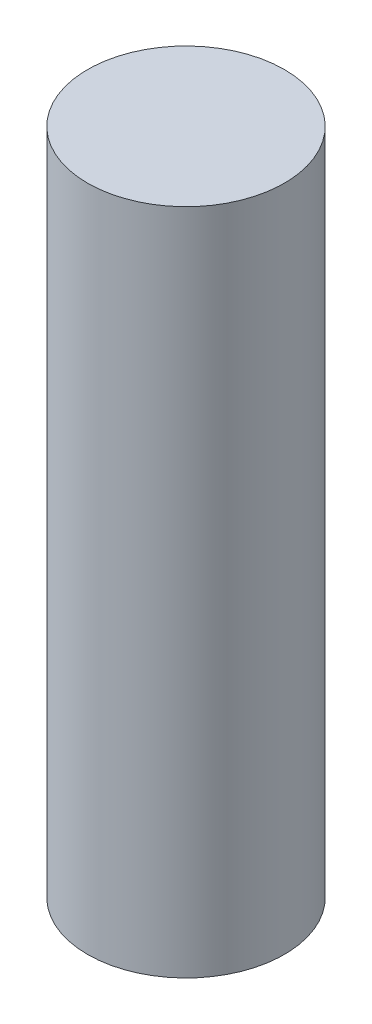
ISO-10303-21;
HEADER;
FILE_DESCRIPTION(('STEP AP214'),'2;1');
FILE_NAME('part.step','',(''),(''),'','','');
FILE_SCHEMA(('AUTOMOTIVE_DESIGN { 1 0 10303 214 1 1 1 1 }'));
ENDSEC;
DATA;
#1=APPLICATION_CONTEXT('core data for automotive mechanical design processes');
#2=APPLICATION_PROTOCOL_DEFINITION('international standard','automotive_design',2000,#1);
#3=PRODUCT_CONTEXT('',#1,'mechanical');
#4=PRODUCT('Part','Part','',(#3));
#5=PRODUCT_RELATED_PRODUCT_CATEGORY('part','',(#4));
#6=PRODUCT_DEFINITION_FORMATION('','',#4);
#7=PRODUCT_DEFINITION_CONTEXT('part definition',#1,'design');
#8=PRODUCT_DEFINITION('design','',#6,#7);
#9=PRODUCT_DEFINITION_SHAPE('','',#8);
#10=(LENGTH_UNIT() NAMED_UNIT(*) SI_UNIT(.MILLI.,.METRE.));
#11=(NAMED_UNIT(*) PLANE_ANGLE_UNIT() SI_UNIT($,.RADIAN.));
#12=(NAMED_UNIT(*) SI_UNIT($,.STERADIAN.) SOLID_ANGLE_UNIT());
#13=UNCERTAINTY_MEASURE_WITH_UNIT(LENGTH_MEASURE(1.E-05),#10,'distance_accuracy_value','');
#14=(GEOMETRIC_REPRESENTATION_CONTEXT(3) GLOBAL_UNCERTAINTY_ASSIGNED_CONTEXT((#13)) GLOBAL_UNIT_ASSIGNED_CONTEXT((#10,
#11,#12)) REPRESENTATION_CONTEXT('',''));
#15=CARTESIAN_POINT('',(0.,0.,0.));
#16=DIRECTION('',(0.,0.,1.));
#17=DIRECTION('',(1.,0.,0.));
#18=AXIS2_PLACEMENT_3D('',#15,#16,#17);
#19=CARTESIAN_POINT('',(0.,9.5,0.));
#20=DIRECTION('',(0.,-1.,0.));
#21=DIRECTION('',(0.,0.,-1.));
#22=AXIS2_PLACEMENT_3D('',#19,#20,#21);
#23=CYLINDRICAL_SURFACE('',#22,1.4);
#24=CARTESIAN_POINT('',(0.,9.5,0.));
#25=DIRECTION('',(0.,1.,0.));
#26=DIRECTION('',(0.,0.,1.));
#27=AXIS2_PLACEMENT_3D('',#24,#25,#26);
#28=CIRCLE('',#27,1.4);
#29=CARTESIAN_POINT('',(0.,9.5,1.4));
#30=VERTEX_POINT('',#29);
#31=EDGE_CURVE('E10',#30,#30,#28,.T.);
#32=ORIENTED_EDGE('',*,*,#31,.F.);
#33=EDGE_LOOP('',(#32));
#34=FACE_BOUND('',#33,.T.);
#35=CARTESIAN_POINT('',(0.,0.,0.));
#36=DIRECTION('',(0.,1.,0.));
#37=DIRECTION('',(0.,0.,1.));
#38=AXIS2_PLACEMENT_3D('',#35,#36,#37);
#39=CIRCLE('',#38,1.4);
#40=CARTESIAN_POINT('',(0.,0.,1.4));
#41=VERTEX_POINT('',#40);
#42=EDGE_CURVE('E40',#41,#41,#39,.T.);
#43=ORIENTED_EDGE('',*,*,#42,.T.);
#44=EDGE_LOOP('',(#43));
#45=FACE_BOUND('',#44,.T.);
#46=ADVANCED_FACE('F37',(#34,#45),#23,.T.);
#47=CARTESIAN_POINT('',(0.,9.5,0.));
#48=DIRECTION('',(0.,1.,0.));
#49=DIRECTION('',(0.,0.,1.));
#50=AXIS2_PLACEMENT_3D('',#47,#48,#49);
#51=PLANE('',#50);
#52=ORIENTED_EDGE('',*,*,#31,.T.);
#53=EDGE_LOOP('',(#52));
#54=FACE_BOUND('',#53,.T.);
#55=ADVANCED_FACE('F54',(#54),#51,.T.);
#56=CARTESIAN_POINT('',(0.,0.,0.));
#57=DIRECTION('',(0.,1.,0.));
#58=DIRECTION('',(0.,0.,1.));
#59=AXIS2_PLACEMENT_3D('',#56,#57,#58);
#60=PLANE('',#59);
#61=ORIENTED_EDGE('',*,*,#42,.F.);
#62=EDGE_LOOP('',(#61));
#63=FACE_BOUND('',#62,.T.);
#64=ADVANCED_FACE('F52',(#63),#60,.F.);
#65=CLOSED_SHELL('',(#46,#55,#64));
#66=MANIFOLD_SOLID_BREP('B2',#65);
#67=ADVANCED_BREP_SHAPE_REPRESENTATION('',(#18,#66),#14);
#68=SHAPE_DEFINITION_REPRESENTATION(#9,#67);
ENDSEC;
END-ISO-10303-21;
